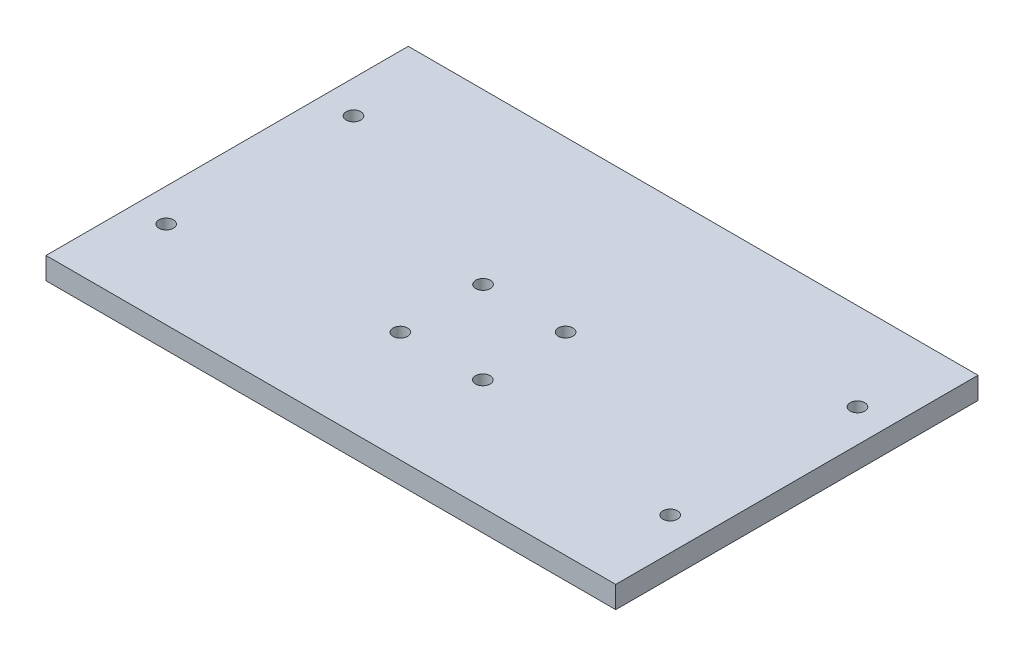
ISO-10303-21;
HEADER;
FILE_DESCRIPTION(('STEP AP214'),'2;1');
FILE_NAME('part.step','',(''),(''),'','','');
FILE_SCHEMA(('AUTOMOTIVE_DESIGN { 1 0 10303 214 1 1 1 1 }'));
ENDSEC;
DATA;
#1=APPLICATION_CONTEXT('core data for automotive mechanical design processes');
#2=APPLICATION_PROTOCOL_DEFINITION('international standard','automotive_design',2000,#1);
#3=PRODUCT_CONTEXT('',#1,'mechanical');
#4=PRODUCT('Part','Part','',(#3));
#5=PRODUCT_RELATED_PRODUCT_CATEGORY('part','',(#4));
#6=PRODUCT_DEFINITION_FORMATION('','',#4);
#7=PRODUCT_DEFINITION_CONTEXT('part definition',#1,'design');
#8=PRODUCT_DEFINITION('design','',#6,#7);
#9=PRODUCT_DEFINITION_SHAPE('','',#8);
#10=(LENGTH_UNIT() NAMED_UNIT(*) SI_UNIT(.MILLI.,.METRE.));
#11=(NAMED_UNIT(*) PLANE_ANGLE_UNIT() SI_UNIT($,.RADIAN.));
#12=(NAMED_UNIT(*) SI_UNIT($,.STERADIAN.) SOLID_ANGLE_UNIT());
#13=UNCERTAINTY_MEASURE_WITH_UNIT(LENGTH_MEASURE(1.E-05),#10,'distance_accuracy_value','');
#14=(GEOMETRIC_REPRESENTATION_CONTEXT(3) GLOBAL_UNCERTAINTY_ASSIGNED_CONTEXT((#13)) GLOBAL_UNIT_ASSIGNED_CONTEXT((#10,
#11,#12)) REPRESENTATION_CONTEXT('',''));
#15=CARTESIAN_POINT('',(0.,0.,0.));
#16=DIRECTION('',(0.,0.,1.));
#17=DIRECTION('',(1.,0.,0.));
#18=AXIS2_PLACEMENT_3D('',#15,#16,#17);
#19=CARTESIAN_POINT('',(1.11133349305718E-12,355.000000000003,0.));
#20=DIRECTION('',(0.,1.,0.));
#21=DIRECTION('',(-1.,0.,0.));
#22=AXIS2_PLACEMENT_3D('',#19,#20,#21);
#23=PLANE('',#22);
#24=CARTESIAN_POINT('',(-253.891339354961,355.000000000004,606.081360458565));
#25=DIRECTION('',(0.,1.,0.));
#26=DIRECTION('',(-1.,0.,0.));
#27=AXIS2_PLACEMENT_3D('',#24,#25,#26);
#28=CIRCLE('',#27,4.99999999999994);
#29=CARTESIAN_POINT('',(-258.891339354961,355.000000000004,606.081360458565));
#30=VERTEX_POINT('',#29);
#31=EDGE_CURVE('E178',#30,#30,#28,.T.);
#32=ORIENTED_EDGE('',*,*,#31,.F.);
#33=EDGE_LOOP('',(#32));
#34=FACE_BOUND('',#33,.T.);
#35=CARTESIAN_POINT('',(-197.384432092848,355.000000000004,549.45118273083));
#36=DIRECTION('',(0.,1.,0.));
#37=DIRECTION('',(-1.,0.,0.));
#38=AXIS2_PLACEMENT_3D('',#35,#36,#37);
#39=CIRCLE('',#38,5.0000000000001);
#40=CARTESIAN_POINT('',(-202.384432092848,355.000000000004,549.45118273083));
#41=VERTEX_POINT('',#40);
#42=EDGE_CURVE('E190',#41,#41,#39,.T.);
#43=ORIENTED_EDGE('',*,*,#42,.F.);
#44=EDGE_LOOP('',(#43));
#45=FACE_BOUND('',#44,.T.);
#46=CARTESIAN_POINT('',(-398.137885723904,355.000000000004,493.881423438817));
#47=DIRECTION('',(0.,1.,0.));
#48=DIRECTION('',(1.,0.,0.));
#49=AXIS2_PLACEMENT_3D('',#46,#47,#48);
#50=CIRCLE('',#49,4.99999999999224);
#51=CARTESIAN_POINT('',(-393.137885723912,355.000000000004,493.881423438817));
#52=VERTEX_POINT('',#51);
#53=EDGE_CURVE('E202',#52,#52,#50,.T.);
#54=ORIENTED_EDGE('',*,*,#53,.F.);
#55=EDGE_LOOP('',(#54));
#56=FACE_BOUND('',#55,.T.);
#57=CARTESIAN_POINT('',(-53.1378857238827,355.000000000003,493.881423438817));
#58=DIRECTION('',(0.,1.,0.));
#59=DIRECTION('',(-1.,0.,0.));
#60=AXIS2_PLACEMENT_3D('',#57,#58,#59);
#61=CIRCLE('',#60,5.00000000000005);
#62=CARTESIAN_POINT('',(-58.1378857238827,355.000000000003,493.881423438817));
#63=VERTEX_POINT('',#62);
#64=EDGE_CURVE('E105',#63,#63,#61,.T.);
#65=ORIENTED_EDGE('',*,*,#64,.F.);
#66=EDGE_LOOP('',(#65));
#67=FACE_BOUND('',#66,.T.);
#68=DIRECTION('',(0.,0.,-1.));
#69=VECTOR('',#68,1.);
#70=CARTESIAN_POINT('',(-30.6378857238943,355.000000000003,433.881423438817));
#71=LINE('',#70,#69);
#72=CARTESIAN_POINT('',(-30.6378857238942,355.000000000003,681.858342537782));
#73=VERTEX_POINT('',#72);
#74=CARTESIAN_POINT('',(-30.6378857238943,355.000000000003,433.881423438817));
#75=VERTEX_POINT('',#74);
#76=EDGE_CURVE('E56',#73,#75,#71,.T.);
#77=ORIENTED_EDGE('',*,*,#76,.T.);
#78=DIRECTION('',(-1.,0.,0.));
#79=VECTOR('',#78,1.);
#80=CARTESIAN_POINT('',(-420.637885723892,355.000000000004,433.881423438817));
#81=LINE('',#80,#79);
#82=CARTESIAN_POINT('',(-420.637885723892,355.000000000004,433.881423438817));
#83=VERTEX_POINT('',#82);
#84=EDGE_CURVE('E86',#75,#83,#81,.T.);
#85=ORIENTED_EDGE('',*,*,#84,.T.);
#86=DIRECTION('',(0.,0.,1.));
#87=VECTOR('',#86,1.);
#88=CARTESIAN_POINT('',(-420.637885723892,355.000000000004,455.858342537751));
#89=LINE('',#88,#87);
#90=CARTESIAN_POINT('',(-420.637885723892,355.000000000004,681.858342537782));
#91=VERTEX_POINT('',#90);
#92=EDGE_CURVE('E90',#83,#91,#89,.T.);
#93=ORIENTED_EDGE('',*,*,#92,.T.);
#94=DIRECTION('',(1.,0.,0.));
#95=VECTOR('',#94,1.);
#96=CARTESIAN_POINT('',(-420.637885723892,355.000000000004,681.858342537782));
#97=LINE('',#96,#95);
#98=EDGE_CURVE('E98',#91,#73,#97,.T.);
#99=ORIENTED_EDGE('',*,*,#98,.T.);
#100=EDGE_LOOP('',(#77,#85,#93,#99));
#101=FACE_BOUND('',#100,.T.);
#102=CARTESIAN_POINT('',(-53.1378857238827,355.000000000003,622.094154378911));
#103=DIRECTION('',(0.,1.,0.));
#104=DIRECTION('',(1.,0.,0.));
#105=AXIS2_PLACEMENT_3D('',#102,#103,#104);
#106=CIRCLE('',#105,5.00000000000005);
#107=CARTESIAN_POINT('',(-48.1378857238826,355.000000000003,622.094154378911));
#108=VERTEX_POINT('',#107);
#109=EDGE_CURVE('E208',#108,#108,#106,.T.);
#110=ORIENTED_EDGE('',*,*,#109,.F.);
#111=EDGE_LOOP('',(#110));
#112=FACE_BOUND('',#111,.T.);
#113=CARTESIAN_POINT('',(-398.137885723904,355.000000000004,622.094154378911));
#114=DIRECTION('',(0.,1.,0.));
#115=DIRECTION('',(-1.,0.,0.));
#116=AXIS2_PLACEMENT_3D('',#113,#114,#115);
#117=CIRCLE('',#116,4.99999999999219);
#118=CARTESIAN_POINT('',(-403.137885723896,355.000000000004,622.094154378911));
#119=VERTEX_POINT('',#118);
#120=EDGE_CURVE('E196',#119,#119,#117,.T.);
#121=ORIENTED_EDGE('',*,*,#120,.F.);
#122=EDGE_LOOP('',(#121));
#123=FACE_BOUND('',#122,.T.);
#124=CARTESIAN_POINT('',(-197.384432092848,355.000000000004,606.081360458565));
#125=DIRECTION('',(0.,1.,0.));
#126=DIRECTION('',(-1.,0.,0.));
#127=AXIS2_PLACEMENT_3D('',#124,#125,#126);
#128=CIRCLE('',#127,5.0000000000001);
#129=CARTESIAN_POINT('',(-202.384432092848,355.000000000004,606.081360458565));
#130=VERTEX_POINT('',#129);
#131=EDGE_CURVE('E184',#130,#130,#128,.T.);
#132=ORIENTED_EDGE('',*,*,#131,.F.);
#133=EDGE_LOOP('',(#132));
#134=FACE_BOUND('',#133,.T.);
#135=CARTESIAN_POINT('',(-253.891339354961,355.000000000004,549.45118273083));
#136=DIRECTION('',(0.,1.,0.));
#137=DIRECTION('',(-1.,0.,0.));
#138=AXIS2_PLACEMENT_3D('',#135,#136,#137);
#139=CIRCLE('',#138,4.99999999999994);
#140=CARTESIAN_POINT('',(-258.891339354961,355.000000000004,549.45118273083));
#141=VERTEX_POINT('',#140);
#142=EDGE_CURVE('E169',#141,#141,#139,.T.);
#143=ORIENTED_EDGE('',*,*,#142,.F.);
#144=EDGE_LOOP('',(#143));
#145=FACE_BOUND('',#144,.T.);
#146=ADVANCED_FACE('F39',(#34,#45,#56,#67,#101,#112,#123,#134,#145),#23,.T.);
#147=CARTESIAN_POINT('',(1.0646754133585E-12,340.000000000003,0.));
#148=DIRECTION('',(0.,1.,0.));
#149=DIRECTION('',(-1.,0.,0.));
#150=AXIS2_PLACEMENT_3D('',#147,#148,#149);
#151=PLANE('',#150);
#152=DIRECTION('',(-1.,0.,0.));
#153=VECTOR('',#152,1.);
#154=CARTESIAN_POINT('',(-420.637885723892,340.000000000004,433.881423438817));
#155=LINE('',#154,#153);
#156=CARTESIAN_POINT('',(-30.6378857238944,340.000000000003,433.881423438817));
#157=VERTEX_POINT('',#156);
#158=CARTESIAN_POINT('',(-420.637885723892,340.000000000004,433.881423438817));
#159=VERTEX_POINT('',#158);
#160=EDGE_CURVE('E94',#157,#159,#155,.T.);
#161=ORIENTED_EDGE('',*,*,#160,.F.);
#162=DIRECTION('',(0.,0.,-1.));
#163=VECTOR('',#162,1.);
#164=CARTESIAN_POINT('',(-30.6378857238943,340.000000000003,681.858342537782));
#165=LINE('',#164,#163);
#166=CARTESIAN_POINT('',(-30.6378857238943,340.000000000003,681.858342537782));
#167=VERTEX_POINT('',#166);
#168=EDGE_CURVE('E108',#167,#157,#165,.T.);
#169=ORIENTED_EDGE('',*,*,#168,.F.);
#170=DIRECTION('',(1.,0.,0.));
#171=VECTOR('',#170,1.);
#172=CARTESIAN_POINT('',(-420.637885723892,340.000000000004,681.858342537782));
#173=LINE('',#172,#171);
#174=CARTESIAN_POINT('',(-420.637885723892,340.000000000004,681.858342537782));
#175=VERTEX_POINT('',#174);
#176=EDGE_CURVE('E80',#175,#167,#173,.T.);
#177=ORIENTED_EDGE('',*,*,#176,.F.);
#178=DIRECTION('',(0.,0.,1.));
#179=VECTOR('',#178,1.);
#180=CARTESIAN_POINT('',(-420.637885723892,340.000000000004,681.858342537782));
#181=LINE('',#180,#179);
#182=EDGE_CURVE('E73',#159,#175,#181,.T.);
#183=ORIENTED_EDGE('',*,*,#182,.F.);
#184=EDGE_LOOP('',(#161,#169,#177,#183));
#185=FACE_BOUND('',#184,.T.);
#186=CARTESIAN_POINT('',(-53.1378857238827,340.000000000003,493.881423438817));
#187=DIRECTION('',(0.,1.,0.));
#188=DIRECTION('',(-1.,0.,0.));
#189=AXIS2_PLACEMENT_3D('',#186,#187,#188);
#190=CIRCLE('',#189,5.00000000000005);
#191=CARTESIAN_POINT('',(-58.1378857238828,340.000000000003,493.881423438817));
#192=VERTEX_POINT('',#191);
#193=EDGE_CURVE('E211',#192,#192,#190,.T.);
#194=ORIENTED_EDGE('',*,*,#193,.T.);
#195=EDGE_LOOP('',(#194));
#196=FACE_BOUND('',#195,.T.);
#197=CARTESIAN_POINT('',(-53.1378857238827,340.000000000003,622.094154378911));
#198=DIRECTION('',(0.,1.,0.));
#199=DIRECTION('',(1.,0.,0.));
#200=AXIS2_PLACEMENT_3D('',#197,#198,#199);
#201=CIRCLE('',#200,5.00000000000005);
#202=CARTESIAN_POINT('',(-48.1378857238827,340.000000000003,622.094154378911));
#203=VERTEX_POINT('',#202);
#204=EDGE_CURVE('E205',#203,#203,#201,.T.);
#205=ORIENTED_EDGE('',*,*,#204,.T.);
#206=EDGE_LOOP('',(#205));
#207=FACE_BOUND('',#206,.T.);
#208=CARTESIAN_POINT('',(-398.137885723904,340.000000000004,493.881423438817));
#209=DIRECTION('',(0.,1.,0.));
#210=DIRECTION('',(1.,0.,0.));
#211=AXIS2_PLACEMENT_3D('',#208,#209,#210);
#212=CIRCLE('',#211,4.99999999999224);
#213=CARTESIAN_POINT('',(-393.137885723912,340.000000000004,493.881423438817));
#214=VERTEX_POINT('',#213);
#215=EDGE_CURVE('E199',#214,#214,#212,.T.);
#216=ORIENTED_EDGE('',*,*,#215,.T.);
#217=EDGE_LOOP('',(#216));
#218=FACE_BOUND('',#217,.T.);
#219=CARTESIAN_POINT('',(-398.137885723904,340.000000000004,622.094154378911));
#220=DIRECTION('',(0.,1.,0.));
#221=DIRECTION('',(-1.,0.,0.));
#222=AXIS2_PLACEMENT_3D('',#219,#220,#221);
#223=CIRCLE('',#222,4.99999999999219);
#224=CARTESIAN_POINT('',(-403.137885723896,340.000000000004,622.094154378911));
#225=VERTEX_POINT('',#224);
#226=EDGE_CURVE('E193',#225,#225,#223,.T.);
#227=ORIENTED_EDGE('',*,*,#226,.T.);
#228=EDGE_LOOP('',(#227));
#229=FACE_BOUND('',#228,.T.);
#230=CARTESIAN_POINT('',(-197.384432092848,340.000000000004,549.45118273083));
#231=DIRECTION('',(0.,1.,0.));
#232=DIRECTION('',(-1.,0.,0.));
#233=AXIS2_PLACEMENT_3D('',#230,#231,#232);
#234=CIRCLE('',#233,5.0000000000001);
#235=CARTESIAN_POINT('',(-202.384432092848,340.000000000004,549.45118273083));
#236=VERTEX_POINT('',#235);
#237=EDGE_CURVE('E187',#236,#236,#234,.T.);
#238=ORIENTED_EDGE('',*,*,#237,.T.);
#239=EDGE_LOOP('',(#238));
#240=FACE_BOUND('',#239,.T.);
#241=CARTESIAN_POINT('',(-197.384432092848,340.000000000004,606.081360458565));
#242=DIRECTION('',(0.,1.,0.));
#243=DIRECTION('',(-1.,0.,0.));
#244=AXIS2_PLACEMENT_3D('',#241,#242,#243);
#245=CIRCLE('',#244,5.0000000000001);
#246=CARTESIAN_POINT('',(-202.384432092848,340.000000000004,606.081360458565));
#247=VERTEX_POINT('',#246);
#248=EDGE_CURVE('E181',#247,#247,#245,.T.);
#249=ORIENTED_EDGE('',*,*,#248,.T.);
#250=EDGE_LOOP('',(#249));
#251=FACE_BOUND('',#250,.T.);
#252=CARTESIAN_POINT('',(-253.891339354961,340.000000000004,606.081360458565));
#253=DIRECTION('',(0.,1.,0.));
#254=DIRECTION('',(-1.,0.,0.));
#255=AXIS2_PLACEMENT_3D('',#252,#253,#254);
#256=CIRCLE('',#255,4.99999999999994);
#257=CARTESIAN_POINT('',(-258.891339354961,340.000000000004,606.081360458565));
#258=VERTEX_POINT('',#257);
#259=EDGE_CURVE('E175',#258,#258,#256,.T.);
#260=ORIENTED_EDGE('',*,*,#259,.T.);
#261=EDGE_LOOP('',(#260));
#262=FACE_BOUND('',#261,.T.);
#263=CARTESIAN_POINT('',(-253.891339354961,340.000000000004,549.45118273083));
#264=DIRECTION('',(0.,1.,0.));
#265=DIRECTION('',(-1.,0.,0.));
#266=AXIS2_PLACEMENT_3D('',#263,#264,#265);
#267=CIRCLE('',#266,4.99999999999994);
#268=CARTESIAN_POINT('',(-258.891339354961,340.000000000004,549.45118273083));
#269=VERTEX_POINT('',#268);
#270=EDGE_CURVE('E172',#269,#269,#267,.T.);
#271=ORIENTED_EDGE('',*,*,#270,.T.);
#272=EDGE_LOOP('',(#271));
#273=FACE_BOUND('',#272,.T.);
#274=ADVANCED_FACE('F114',(#185,#196,#207,#218,#229,#240,#251,#262,#273),#151,.F.);
#275=CARTESIAN_POINT('',(-420.637885723892,355.000000000004,433.881423438817));
#276=DIRECTION('',(0.,0.,1.));
#277=DIRECTION('',(1.,0.,0.));
#278=AXIS2_PLACEMENT_3D('',#275,#276,#277);
#279=PLANE('',#278);
#280=ORIENTED_EDGE('',*,*,#160,.T.);
#281=DIRECTION('',(0.,-1.,0.));
#282=VECTOR('',#281,1.);
#283=CARTESIAN_POINT('',(-420.637885723892,355.000000000004,433.881423438817));
#284=LINE('',#283,#282);
#285=EDGE_CURVE('E48',#83,#159,#284,.T.);
#286=ORIENTED_EDGE('',*,*,#285,.F.);
#287=ORIENTED_EDGE('',*,*,#84,.F.);
#288=DIRECTION('',(0.,-1.,0.));
#289=VECTOR('',#288,1.);
#290=CARTESIAN_POINT('',(-30.6378857238943,355.000000000003,433.881423438817));
#291=LINE('',#290,#289);
#292=EDGE_CURVE('E11',#75,#157,#291,.T.);
#293=ORIENTED_EDGE('',*,*,#292,.T.);
#294=EDGE_LOOP('',(#280,#286,#287,#293));
#295=FACE_BOUND('',#294,.T.);
#296=ADVANCED_FACE('F41',(#295),#279,.F.);
#297=CARTESIAN_POINT('',(-420.637885723892,355.000000000004,681.858342537782));
#298=DIRECTION('',(1.,0.,0.));
#299=DIRECTION('',(0.,1.,0.));
#300=AXIS2_PLACEMENT_3D('',#297,#298,#299);
#301=PLANE('',#300);
#302=ORIENTED_EDGE('',*,*,#182,.T.);
#303=DIRECTION('',(0.,-1.,0.));
#304=VECTOR('',#303,1.);
#305=CARTESIAN_POINT('',(-420.637885723892,355.000000000004,681.858342537782));
#306=LINE('',#305,#304);
#307=EDGE_CURVE('E95',#91,#175,#306,.T.);
#308=ORIENTED_EDGE('',*,*,#307,.F.);
#309=ORIENTED_EDGE('',*,*,#92,.F.);
#310=ORIENTED_EDGE('',*,*,#285,.T.);
#311=EDGE_LOOP('',(#302,#308,#309,#310));
#312=FACE_BOUND('',#311,.T.);
#313=ADVANCED_FACE('F96',(#312),#301,.F.);
#314=CARTESIAN_POINT('',(-420.637885723892,355.000000000004,681.858342537782));
#315=DIRECTION('',(0.,0.,-1.));
#316=DIRECTION('',(0.,1.,0.));
#317=AXIS2_PLACEMENT_3D('',#314,#315,#316);
#318=PLANE('',#317);
#319=ORIENTED_EDGE('',*,*,#176,.T.);
#320=DIRECTION('',(0.,-1.,0.));
#321=VECTOR('',#320,1.);
#322=CARTESIAN_POINT('',(-30.6378857238942,355.000000000003,681.858342537782));
#323=LINE('',#322,#321);
#324=EDGE_CURVE('E100',#73,#167,#323,.T.);
#325=ORIENTED_EDGE('',*,*,#324,.F.);
#326=ORIENTED_EDGE('',*,*,#98,.F.);
#327=ORIENTED_EDGE('',*,*,#307,.T.);
#328=EDGE_LOOP('',(#319,#325,#326,#327));
#329=FACE_BOUND('',#328,.T.);
#330=ADVANCED_FACE('F111',(#329),#318,.F.);
#331=CARTESIAN_POINT('',(-30.6378857238942,355.000000000003,681.858342537782));
#332=DIRECTION('',(-1.,0.,0.));
#333=DIRECTION('',(0.,-1.,0.));
#334=AXIS2_PLACEMENT_3D('',#331,#332,#333);
#335=PLANE('',#334);
#336=ORIENTED_EDGE('',*,*,#168,.T.);
#337=ORIENTED_EDGE('',*,*,#292,.F.);
#338=ORIENTED_EDGE('',*,*,#76,.F.);
#339=ORIENTED_EDGE('',*,*,#324,.T.);
#340=EDGE_LOOP('',(#336,#337,#338,#339));
#341=FACE_BOUND('',#340,.T.);
#342=ADVANCED_FACE('F116',(#341),#335,.F.);
#343=CARTESIAN_POINT('',(-53.1378857238827,355.000000000003,493.881423438817));
#344=DIRECTION('',(0.,-1.,0.));
#345=DIRECTION('',(1.,0.,0.));
#346=AXIS2_PLACEMENT_3D('',#343,#344,#345);
#347=CYLINDRICAL_SURFACE('',#346,5.00000000000005);
#348=ORIENTED_EDGE('',*,*,#64,.T.);
#349=EDGE_LOOP('',(#348));
#350=FACE_BOUND('',#349,.T.);
#351=ORIENTED_EDGE('',*,*,#193,.F.);
#352=EDGE_LOOP('',(#351));
#353=FACE_BOUND('',#352,.T.);
#354=ADVANCED_FACE('F118',(#350,#353),#347,.F.);
#355=CARTESIAN_POINT('',(-53.1378857238827,355.000000000003,622.094154378911));
#356=DIRECTION('',(0.,-1.,0.));
#357=DIRECTION('',(1.,0.,0.));
#358=AXIS2_PLACEMENT_3D('',#355,#356,#357);
#359=CYLINDRICAL_SURFACE('',#358,5.00000000000005);
#360=ORIENTED_EDGE('',*,*,#109,.T.);
#361=EDGE_LOOP('',(#360));
#362=FACE_BOUND('',#361,.T.);
#363=ORIENTED_EDGE('',*,*,#204,.F.);
#364=EDGE_LOOP('',(#363));
#365=FACE_BOUND('',#364,.T.);
#366=ADVANCED_FACE('F124',(#362,#365),#359,.F.);
#367=CARTESIAN_POINT('',(-398.137885723904,355.000000000004,493.881423438817));
#368=DIRECTION('',(0.,-1.,0.));
#369=DIRECTION('',(1.,0.,0.));
#370=AXIS2_PLACEMENT_3D('',#367,#368,#369);
#371=CYLINDRICAL_SURFACE('',#370,4.99999999999224);
#372=ORIENTED_EDGE('',*,*,#53,.T.);
#373=EDGE_LOOP('',(#372));
#374=FACE_BOUND('',#373,.T.);
#375=ORIENTED_EDGE('',*,*,#215,.F.);
#376=EDGE_LOOP('',(#375));
#377=FACE_BOUND('',#376,.T.);
#378=ADVANCED_FACE('F140',(#374,#377),#371,.F.);
#379=CARTESIAN_POINT('',(-398.137885723904,355.000000000004,622.094154378911));
#380=DIRECTION('',(0.,-1.,0.));
#381=DIRECTION('',(1.,0.,0.));
#382=AXIS2_PLACEMENT_3D('',#379,#380,#381);
#383=CYLINDRICAL_SURFACE('',#382,4.99999999999219);
#384=ORIENTED_EDGE('',*,*,#120,.T.);
#385=EDGE_LOOP('',(#384));
#386=FACE_BOUND('',#385,.T.);
#387=ORIENTED_EDGE('',*,*,#226,.F.);
#388=EDGE_LOOP('',(#387));
#389=FACE_BOUND('',#388,.T.);
#390=ADVANCED_FACE('F144',(#386,#389),#383,.F.);
#391=CARTESIAN_POINT('',(-197.384432092848,355.000000000004,549.45118273083));
#392=DIRECTION('',(0.,-1.,0.));
#393=DIRECTION('',(1.,0.,0.));
#394=AXIS2_PLACEMENT_3D('',#391,#392,#393);
#395=CYLINDRICAL_SURFACE('',#394,5.0000000000001);
#396=ORIENTED_EDGE('',*,*,#42,.T.);
#397=EDGE_LOOP('',(#396));
#398=FACE_BOUND('',#397,.T.);
#399=ORIENTED_EDGE('',*,*,#237,.F.);
#400=EDGE_LOOP('',(#399));
#401=FACE_BOUND('',#400,.T.);
#402=ADVANCED_FACE('F148',(#398,#401),#395,.F.);
#403=CARTESIAN_POINT('',(-197.384432092848,355.000000000004,606.081360458565));
#404=DIRECTION('',(0.,-1.,0.));
#405=DIRECTION('',(1.,0.,0.));
#406=AXIS2_PLACEMENT_3D('',#403,#404,#405);
#407=CYLINDRICAL_SURFACE('',#406,5.0000000000001);
#408=ORIENTED_EDGE('',*,*,#131,.T.);
#409=EDGE_LOOP('',(#408));
#410=FACE_BOUND('',#409,.T.);
#411=ORIENTED_EDGE('',*,*,#248,.F.);
#412=EDGE_LOOP('',(#411));
#413=FACE_BOUND('',#412,.T.);
#414=ADVANCED_FACE('F152',(#410,#413),#407,.F.);
#415=CARTESIAN_POINT('',(-253.891339354961,355.000000000004,606.081360458565));
#416=DIRECTION('',(0.,-1.,0.));
#417=DIRECTION('',(1.,0.,0.));
#418=AXIS2_PLACEMENT_3D('',#415,#416,#417);
#419=CYLINDRICAL_SURFACE('',#418,4.99999999999994);
#420=ORIENTED_EDGE('',*,*,#31,.T.);
#421=EDGE_LOOP('',(#420));
#422=FACE_BOUND('',#421,.T.);
#423=ORIENTED_EDGE('',*,*,#259,.F.);
#424=EDGE_LOOP('',(#423));
#425=FACE_BOUND('',#424,.T.);
#426=ADVANCED_FACE('F156',(#422,#425),#419,.F.);
#427=CARTESIAN_POINT('',(-253.891339354961,355.000000000004,549.45118273083));
#428=DIRECTION('',(0.,-1.,0.));
#429=DIRECTION('',(1.,0.,0.));
#430=AXIS2_PLACEMENT_3D('',#427,#428,#429);
#431=CYLINDRICAL_SURFACE('',#430,4.99999999999994);
#432=ORIENTED_EDGE('',*,*,#142,.T.);
#433=EDGE_LOOP('',(#432));
#434=FACE_BOUND('',#433,.T.);
#435=ORIENTED_EDGE('',*,*,#270,.F.);
#436=EDGE_LOOP('',(#435));
#437=FACE_BOUND('',#436,.T.);
#438=ADVANCED_FACE('F160',(#434,#437),#431,.F.);
#439=CLOSED_SHELL('',(#146,#274,#296,#313,#330,#342,#354,#366,#378,#390,#402,#414,#426,#438));
#440=MANIFOLD_SOLID_BREP('B2',#439);
#441=ADVANCED_BREP_SHAPE_REPRESENTATION('',(#18,#440),#14);
#442=SHAPE_DEFINITION_REPRESENTATION(#9,#441);
ENDSEC;
END-ISO-10303-21;
